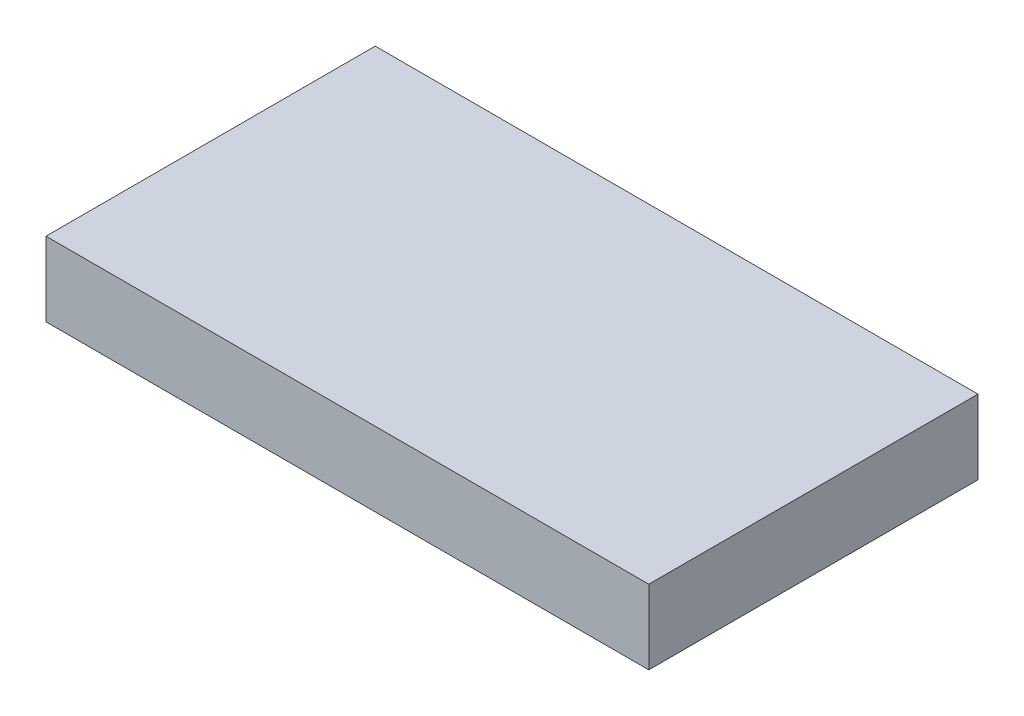
ISO-10303-21;
HEADER;
FILE_DESCRIPTION(('STEP AP214'),'2;1');
FILE_NAME('part.step','',(''),(''),'','','');
FILE_SCHEMA(('AUTOMOTIVE_DESIGN { 1 0 10303 214 1 1 1 1 }'));
ENDSEC;
DATA;
#1=APPLICATION_CONTEXT('core data for automotive mechanical design processes');
#2=APPLICATION_PROTOCOL_DEFINITION('international standard','automotive_design',2000,#1);
#3=PRODUCT_CONTEXT('',#1,'mechanical');
#4=PRODUCT('Part','Part','',(#3));
#5=PRODUCT_RELATED_PRODUCT_CATEGORY('part','',(#4));
#6=PRODUCT_DEFINITION_FORMATION('','',#4);
#7=PRODUCT_DEFINITION_CONTEXT('part definition',#1,'design');
#8=PRODUCT_DEFINITION('design','',#6,#7);
#9=PRODUCT_DEFINITION_SHAPE('','',#8);
#10=(LENGTH_UNIT() NAMED_UNIT(*) SI_UNIT(.MILLI.,.METRE.));
#11=(NAMED_UNIT(*) PLANE_ANGLE_UNIT() SI_UNIT($,.RADIAN.));
#12=(NAMED_UNIT(*) SI_UNIT($,.STERADIAN.) SOLID_ANGLE_UNIT());
#13=UNCERTAINTY_MEASURE_WITH_UNIT(LENGTH_MEASURE(1.E-05),#10,'distance_accuracy_value','');
#14=(GEOMETRIC_REPRESENTATION_CONTEXT(3) GLOBAL_UNCERTAINTY_ASSIGNED_CONTEXT((#13)) GLOBAL_UNIT_ASSIGNED_CONTEXT((#10,
#11,#12)) REPRESENTATION_CONTEXT('',''));
#15=CARTESIAN_POINT('',(0.,0.,0.));
#16=DIRECTION('',(0.,0.,1.));
#17=DIRECTION('',(1.,0.,0.));
#18=AXIS2_PLACEMENT_3D('',#15,#16,#17);
#19=CARTESIAN_POINT('',(16.51,4.064,9.01699999999999));
#20=DIRECTION('',(-1.,0.,0.));
#21=DIRECTION('',(0.,0.,1.));
#22=AXIS2_PLACEMENT_3D('',#19,#20,#21);
#23=PLANE('',#22);
#24=DIRECTION('',(0.,0.,-1.));
#25=VECTOR('',#24,1.);
#26=CARTESIAN_POINT('',(16.51,0.,9.01699999999999));
#27=LINE('',#26,#25);
#28=CARTESIAN_POINT('',(16.51,0.,9.01699999999999));
#29=VERTEX_POINT('',#28);
#30=CARTESIAN_POINT('',(16.51,0.,-9.01700000000001));
#31=VERTEX_POINT('',#30);
#32=EDGE_CURVE('E99',#29,#31,#27,.T.);
#33=ORIENTED_EDGE('',*,*,#32,.T.);
#34=DIRECTION('',(0.,-1.,0.));
#35=VECTOR('',#34,1.);
#36=CARTESIAN_POINT('',(16.51,4.064,-9.01700000000001));
#37=LINE('',#36,#35);
#38=CARTESIAN_POINT('',(16.51,4.064,-9.01700000000001));
#39=VERTEX_POINT('',#38);
#40=EDGE_CURVE('E11',#39,#31,#37,.T.);
#41=ORIENTED_EDGE('',*,*,#40,.F.);
#42=DIRECTION('',(0.,0.,-1.));
#43=VECTOR('',#42,1.);
#44=CARTESIAN_POINT('',(16.51,4.064,9.01699999999999));
#45=LINE('',#44,#43);
#46=CARTESIAN_POINT('',(16.51,4.064,9.01699999999999));
#47=VERTEX_POINT('',#46);
#48=EDGE_CURVE('E87',#47,#39,#45,.T.);
#49=ORIENTED_EDGE('',*,*,#48,.F.);
#50=DIRECTION('',(0.,-1.,0.));
#51=VECTOR('',#50,1.);
#52=CARTESIAN_POINT('',(16.51,4.064,9.01699999999999));
#53=LINE('',#52,#51);
#54=EDGE_CURVE('E95',#47,#29,#53,.T.);
#55=ORIENTED_EDGE('',*,*,#54,.T.);
#56=EDGE_LOOP('',(#33,#41,#49,#55));
#57=FACE_BOUND('',#56,.T.);
#58=ADVANCED_FACE('F36',(#57),#23,.F.);
#59=CARTESIAN_POINT('',(-16.51,4.064,-9.01700000000001));
#60=DIRECTION('',(0.,0.,1.));
#61=DIRECTION('',(1.,0.,0.));
#62=AXIS2_PLACEMENT_3D('',#59,#60,#61);
#63=PLANE('',#62);
#64=DIRECTION('',(-1.,0.,0.));
#65=VECTOR('',#64,1.);
#66=CARTESIAN_POINT('',(-16.51,0.,-9.01700000000001));
#67=LINE('',#66,#65);
#68=CARTESIAN_POINT('',(-16.51,0.,-9.01700000000001));
#69=VERTEX_POINT('',#68);
#70=EDGE_CURVE('E91',#31,#69,#67,.T.);
#71=ORIENTED_EDGE('',*,*,#70,.T.);
#72=DIRECTION('',(0.,-1.,0.));
#73=VECTOR('',#72,1.);
#74=CARTESIAN_POINT('',(-16.51,4.064,-9.01700000000001));
#75=LINE('',#74,#73);
#76=CARTESIAN_POINT('',(-16.51,4.064,-9.01700000000001));
#77=VERTEX_POINT('',#76);
#78=EDGE_CURVE('E44',#77,#69,#75,.T.);
#79=ORIENTED_EDGE('',*,*,#78,.F.);
#80=DIRECTION('',(-1.,0.,0.));
#81=VECTOR('',#80,1.);
#82=CARTESIAN_POINT('',(-16.51,4.064,-9.01700000000001));
#83=LINE('',#82,#81);
#84=EDGE_CURVE('E82',#39,#77,#83,.T.);
#85=ORIENTED_EDGE('',*,*,#84,.F.);
#86=ORIENTED_EDGE('',*,*,#40,.T.);
#87=EDGE_LOOP('',(#71,#79,#85,#86));
#88=FACE_BOUND('',#87,.T.);
#89=ADVANCED_FACE('F90',(#88),#63,.F.);
#90=CARTESIAN_POINT('',(-16.51,4.064,9.01699999999999));
#91=DIRECTION('',(1.,0.,0.));
#92=DIRECTION('',(0.,0.,-1.));
#93=AXIS2_PLACEMENT_3D('',#90,#91,#92);
#94=PLANE('',#93);
#95=DIRECTION('',(0.,0.,1.));
#96=VECTOR('',#95,1.);
#97=CARTESIAN_POINT('',(-16.51,0.,9.01699999999999));
#98=LINE('',#97,#96);
#99=CARTESIAN_POINT('',(-16.51,0.,9.01699999999999));
#100=VERTEX_POINT('',#99);
#101=EDGE_CURVE('E69',#69,#100,#98,.T.);
#102=ORIENTED_EDGE('',*,*,#101,.T.);
#103=DIRECTION('',(0.,-1.,0.));
#104=VECTOR('',#103,1.);
#105=CARTESIAN_POINT('',(-16.51,4.064,9.01699999999999));
#106=LINE('',#105,#104);
#107=CARTESIAN_POINT('',(-16.51,4.064,9.01699999999999));
#108=VERTEX_POINT('',#107);
#109=EDGE_CURVE('E92',#108,#100,#106,.T.);
#110=ORIENTED_EDGE('',*,*,#109,.F.);
#111=DIRECTION('',(0.,0.,1.));
#112=VECTOR('',#111,1.);
#113=CARTESIAN_POINT('',(-16.51,4.064,9.01699999999999));
#114=LINE('',#113,#112);
#115=EDGE_CURVE('E85',#77,#108,#114,.T.);
#116=ORIENTED_EDGE('',*,*,#115,.F.);
#117=ORIENTED_EDGE('',*,*,#78,.T.);
#118=EDGE_LOOP('',(#102,#110,#116,#117));
#119=FACE_BOUND('',#118,.T.);
#120=ADVANCED_FACE('F93',(#119),#94,.F.);
#121=CARTESIAN_POINT('',(-16.51,4.064,9.01699999999999));
#122=DIRECTION('',(0.,0.,-1.));
#123=DIRECTION('',(-1.,0.,0.));
#124=AXIS2_PLACEMENT_3D('',#121,#122,#123);
#125=PLANE('',#124);
#126=DIRECTION('',(1.,0.,0.));
#127=VECTOR('',#126,1.);
#128=CARTESIAN_POINT('',(-16.51,0.,9.01699999999999));
#129=LINE('',#128,#127);
#130=EDGE_CURVE('E75',#100,#29,#129,.T.);
#131=ORIENTED_EDGE('',*,*,#130,.T.);
#132=ORIENTED_EDGE('',*,*,#54,.F.);
#133=DIRECTION('',(1.,0.,0.));
#134=VECTOR('',#133,1.);
#135=CARTESIAN_POINT('',(-16.51,4.064,9.01699999999999));
#136=LINE('',#135,#134);
#137=EDGE_CURVE('E52',#108,#47,#136,.T.);
#138=ORIENTED_EDGE('',*,*,#137,.F.);
#139=ORIENTED_EDGE('',*,*,#109,.T.);
#140=EDGE_LOOP('',(#131,#132,#138,#139));
#141=FACE_BOUND('',#140,.T.);
#142=ADVANCED_FACE('F106',(#141),#125,.F.);
#143=CARTESIAN_POINT('',(0.,4.064,0.));
#144=DIRECTION('',(0.,-1.,0.));
#145=DIRECTION('',(0.,0.,-1.));
#146=AXIS2_PLACEMENT_3D('',#143,#144,#145);
#147=PLANE('',#146);
#148=ORIENTED_EDGE('',*,*,#48,.T.);
#149=ORIENTED_EDGE('',*,*,#84,.T.);
#150=ORIENTED_EDGE('',*,*,#115,.T.);
#151=ORIENTED_EDGE('',*,*,#137,.T.);
#152=EDGE_LOOP('',(#148,#149,#150,#151));
#153=FACE_BOUND('',#152,.T.);
#154=ADVANCED_FACE('F83',(#153),#147,.F.);
#155=CARTESIAN_POINT('',(0.,0.,0.));
#156=DIRECTION('',(0.,-1.,0.));
#157=DIRECTION('',(0.,0.,-1.));
#158=AXIS2_PLACEMENT_3D('',#155,#156,#157);
#159=PLANE('',#158);
#160=ORIENTED_EDGE('',*,*,#32,.F.);
#161=ORIENTED_EDGE('',*,*,#130,.F.);
#162=ORIENTED_EDGE('',*,*,#101,.F.);
#163=ORIENTED_EDGE('',*,*,#70,.F.);
#164=EDGE_LOOP('',(#160,#161,#162,#163));
#165=FACE_BOUND('',#164,.T.);
#166=ADVANCED_FACE('F109',(#165),#159,.T.);
#167=CLOSED_SHELL('',(#58,#89,#120,#142,#154,#166));
#168=MANIFOLD_SOLID_BREP('B2',#167);
#169=ADVANCED_BREP_SHAPE_REPRESENTATION('',(#18,#168),#14);
#170=SHAPE_DEFINITION_REPRESENTATION(#9,#169);
ENDSEC;
END-ISO-10303-21;
